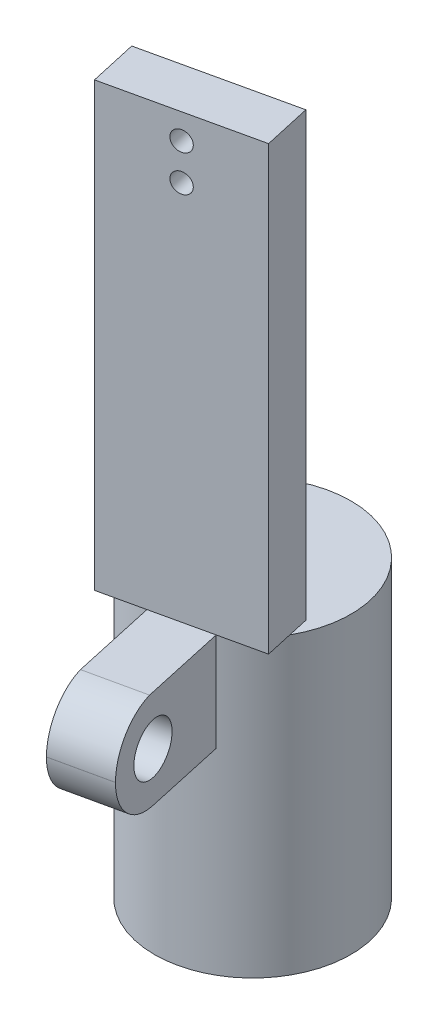
ISO-10303-21;
HEADER;
FILE_DESCRIPTION(('STEP AP214'),'2;1');
FILE_NAME('part.step','',(''),(''),'','','');
FILE_SCHEMA(('AUTOMOTIVE_DESIGN { 1 0 10303 214 1 1 1 1 }'));
ENDSEC;
DATA;
#1=APPLICATION_CONTEXT('core data for automotive mechanical design processes');
#2=APPLICATION_PROTOCOL_DEFINITION('international standard','automotive_design',2000,#1);
#3=PRODUCT_CONTEXT('',#1,'mechanical');
#4=PRODUCT('Part','Part','',(#3));
#5=PRODUCT_RELATED_PRODUCT_CATEGORY('part','',(#4));
#6=PRODUCT_DEFINITION_FORMATION('','',#4);
#7=PRODUCT_DEFINITION_CONTEXT('part definition',#1,'design');
#8=PRODUCT_DEFINITION('design','',#6,#7);
#9=PRODUCT_DEFINITION_SHAPE('','',#8);
#10=(LENGTH_UNIT() NAMED_UNIT(*) SI_UNIT(.MILLI.,.METRE.));
#11=(NAMED_UNIT(*) PLANE_ANGLE_UNIT() SI_UNIT($,.RADIAN.));
#12=(NAMED_UNIT(*) SI_UNIT($,.STERADIAN.) SOLID_ANGLE_UNIT());
#13=UNCERTAINTY_MEASURE_WITH_UNIT(LENGTH_MEASURE(1.E-05),#10,'distance_accuracy_value','');
#14=(GEOMETRIC_REPRESENTATION_CONTEXT(3) GLOBAL_UNCERTAINTY_ASSIGNED_CONTEXT((#13)) GLOBAL_UNIT_ASSIGNED_CONTEXT((#10,
#11,#12)) REPRESENTATION_CONTEXT('',''));
#15=CARTESIAN_POINT('',(0.,0.,0.));
#16=DIRECTION('',(0.,0.,1.));
#17=DIRECTION('',(1.,0.,0.));
#18=AXIS2_PLACEMENT_3D('',#15,#16,#17);
#19=CARTESIAN_POINT('',(0.,30.,0.));
#20=DIRECTION('',(0.,1.,0.));
#21=DIRECTION('',(0.,0.,1.));
#22=AXIS2_PLACEMENT_3D('',#19,#20,#21);
#23=PLANE('',#22);
#24=DIRECTION('',(0.21493462100566,0.,0.976628439424715));
#25=VECTOR('',#24,1.);
#26=CARTESIAN_POINT('',(2.9138020787842,30.,-0.641264292751803));
#27=LINE('',#26,#25);
#28=CARTESIAN_POINT('',(4.96525747374803,30.,8.6802199407267));
#29=VERTEX_POINT('',#28);
#30=CARTESIAN_POINT('',(6.87892830840499,30.,17.3756332346809));
#31=VERTEX_POINT('',#30);
#32=EDGE_CURVE('E320',#29,#31,#27,.T.);
#33=ORIENTED_EDGE('',*,*,#32,.F.);
#34=DIRECTION('',(-0.975868141278159,0.,0.218360643977598));
#35=VECTOR('',#34,1.);
#36=CARTESIAN_POINT('',(2.08642872960106,30.,9.32438780714541));
#37=LINE('',#36,#35);
#38=CARTESIAN_POINT('',(-0.792400014545913,30.,9.96855567356413));
#39=VERTEX_POINT('',#38);
#40=EDGE_CURVE('E11',#29,#39,#37,.T.);
#41=ORIENTED_EDGE('',*,*,#40,.T.);
#42=DIRECTION('',(0.21493462100566,0.,0.976628439424715));
#43=VECTOR('',#42,1.);
#44=CARTESIAN_POINT('',(-2.84830571382161,30.,0.626849971181591));
#45=LINE('',#44,#43);
#46=CARTESIAN_POINT('',(1.11682051579917,30.,18.6437474986143));
#47=VERTEX_POINT('',#46);
#48=EDGE_CURVE('E317',#39,#47,#45,.T.);
#49=ORIENTED_EDGE('',*,*,#48,.T.);
#50=DIRECTION('',(0.976628439424714,0.,-0.21493462100566));
#51=VECTOR('',#50,1.);
#52=CARTESIAN_POINT('',(-10.4195983241497,30.,21.1826616967176));
#53=LINE('',#52,#51);
#54=EDGE_CURVE('E183',#47,#31,#53,.T.);
#55=ORIENTED_EDGE('',*,*,#54,.T.);
#56=EDGE_LOOP('',(#33,#41,#49,#55));
#57=FACE_BOUND('',#56,.T.);
#58=ADVANCED_FACE('F37',(#57),#23,.T.);
#59=CARTESIAN_POINT('',(0.,30.,0.));
#60=DIRECTION('',(0.,1.,0.));
#61=DIRECTION('',(0.,0.,1.));
#62=AXIS2_PLACEMENT_3D('',#59,#60,#61);
#63=CIRCLE('',#62,10.);
#64=CARTESIAN_POINT('',(8.70491565484811,30.,4.92183334154869));
#65=VERTEX_POINT('',#64);
#66=CARTESIAN_POINT('',(-5.77719232770779,30.,8.16235559190325));
#67=VERTEX_POINT('',#66);
#68=EDGE_CURVE('E290',#65,#67,#63,.T.);
#69=ORIENTED_EDGE('',*,*,#68,.T.);
#70=DIRECTION('',(-0.218360643977597,0.,-0.975868141278159));
#71=VECTOR('',#70,1.);
#72=CARTESIAN_POINT('',(-7.24105399127795,30.,1.62026112517727));
#73=LINE('',#72,#71);
#74=CARTESIAN_POINT('',(-6.24642848156488,30.,6.0653082259319));
#75=VERTEX_POINT('',#74);
#76=EDGE_CURVE('E46',#67,#75,#73,.T.);
#77=ORIENTED_EDGE('',*,*,#76,.T.);
#78=DIRECTION('',(0.975868141278159,0.,-0.218360643977598));
#79=VECTOR('',#78,1.);
#80=CARTESIAN_POINT('',(0.994625509713067,30.,4.44504710075462));
#81=LINE('',#80,#79);
#82=CARTESIAN_POINT('',(8.23567950099102,30.,2.82478597557734));
#83=VERTEX_POINT('',#82);
#84=EDGE_CURVE('E155',#75,#83,#81,.T.);
#85=ORIENTED_EDGE('',*,*,#84,.T.);
#86=DIRECTION('',(-0.218360643977598,0.,-0.975868141278159));
#87=VECTOR('',#86,1.);
#88=CARTESIAN_POINT('',(7.24105399127795,30.,-1.62026112517728));
#89=LINE('',#88,#87);
#90=EDGE_CURVE('E166',#65,#83,#89,.T.);
#91=ORIENTED_EDGE('',*,*,#90,.F.);
#92=EDGE_LOOP('',(#69,#77,#85,#91));
#93=FACE_BOUND('',#92,.T.);
#94=ADVANCED_FACE('F221',(#93),#23,.T.);
#95=CARTESIAN_POINT('',(2.9138020787842,20.,-0.641264292751803));
#96=DIRECTION('',(-0.976628439424715,0.,0.21493462100566));
#97=DIRECTION('',(0.21493462100566,0.,0.976628439424715));
#98=AXIS2_PLACEMENT_3D('',#95,#96,#97);
#99=PLANE('',#98);
#100=CARTESIAN_POINT('',(6.77993867446128,25.0087601473406,16.925840217319));
#101=DIRECTION('',(0.976628439424715,0.,-0.21493462100566));
#102=DIRECTION('',(-0.21493462100566,0.,-0.976628439424715));
#103=AXIS2_PLACEMENT_3D('',#100,#101,#102);
#104=CIRCLE('',#103,5.01244331368161);
#105=CARTESIAN_POINT('',(7.85728598844492,25.0139609072337,21.8211335909563));
#106=VERTEX_POINT('',#105);
#107=EDGE_CURVE('E180',#31,#106,#104,.T.);
#108=ORIENTED_EDGE('',*,*,#107,.T.);
#109=DIRECTION('',(0.,1.,0.));
#110=VECTOR('',#109,1.);
#111=CARTESIAN_POINT('',(7.85728627839978,20.,21.8211349084647));
#112=LINE('',#111,#110);
#113=CARTESIAN_POINT('',(7.85728627839979,25.0087601473406,21.8211349084647));
#114=VERTEX_POINT('',#113);
#115=EDGE_CURVE('E293',#114,#106,#112,.T.);
#116=ORIENTED_EDGE('',*,*,#115,.F.);
#117=CARTESIAN_POINT('',(6.77993867446128,25.0087601473406,16.925840217319));
#118=DIRECTION('',(0.976628439424715,0.,-0.21493462100566));
#119=DIRECTION('',(-0.21493462100566,0.,-0.976628439424715));
#120=AXIS2_PLACEMENT_3D('',#117,#118,#119);
#121=CIRCLE('',#120,5.01244331368161);
#122=CARTESIAN_POINT('',(6.82123172639271,20.,17.1134692213304));
#123=VERTEX_POINT('',#122);
#124=EDGE_CURVE('E331',#114,#123,#121,.T.);
#125=ORIENTED_EDGE('',*,*,#124,.T.);
#126=DIRECTION('',(0.21493462100566,0.,0.976628439424715));
#127=VECTOR('',#126,1.);
#128=CARTESIAN_POINT('',(2.9138020787842,20.,-0.641264292751803));
#129=LINE('',#128,#127);
#130=CARTESIAN_POINT('',(4.96525747374803,20.,8.68021994072669));
#131=VERTEX_POINT('',#130);
#132=EDGE_CURVE('E305',#131,#123,#129,.T.);
#133=ORIENTED_EDGE('',*,*,#132,.F.);
#134=DIRECTION('',(0.,1.,0.));
#135=VECTOR('',#134,1.);
#136=CARTESIAN_POINT('',(4.96525747374803,20.,8.68021994072669));
#137=LINE('',#136,#135);
#138=EDGE_CURVE('E288',#131,#29,#137,.T.);
#139=ORIENTED_EDGE('',*,*,#138,.T.);
#140=ORIENTED_EDGE('',*,*,#32,.T.);
#141=EDGE_LOOP('',(#108,#116,#125,#133,#139,#140));
#142=FACE_BOUND('',#141,.T.);
#143=CARTESIAN_POINT('',(6.77993867446128,25.0087601473406,16.925840217319));
#144=DIRECTION('',(0.976628439424715,0.,-0.21493462100566));
#145=DIRECTION('',(-0.21493462100566,0.,-0.976628439424715));
#146=AXIS2_PLACEMENT_3D('',#143,#144,#145);
#147=CIRCLE('',#146,2.55);
#148=CARTESIAN_POINT('',(6.23185539089685,25.0087601473406,14.4354376967859));
#149=VERTEX_POINT('',#148);
#150=EDGE_CURVE('E175',#149,#149,#147,.T.);
#151=ORIENTED_EDGE('',*,*,#150,.F.);
#152=EDGE_LOOP('',(#151));
#153=FACE_BOUND('',#152,.T.);
#154=ADVANCED_FACE('F217',(#142,#153),#99,.F.);
#155=CARTESIAN_POINT('',(-2.84830571382161,20.,0.626849971181591));
#156=DIRECTION('',(-0.976628439424715,0.,0.21493462100566));
#157=DIRECTION('',(0.21493462100566,0.,0.976628439424715));
#158=AXIS2_PLACEMENT_3D('',#155,#156,#157);
#159=PLANE('',#158);
#160=CARTESIAN_POINT('',(1.01783088185546,25.0087601473406,18.1939544812524));
#161=DIRECTION('',(-0.976628439424715,0.,0.21493462100566));
#162=DIRECTION('',(0.21493462100566,0.,0.976628439424715));
#163=AXIS2_PLACEMENT_3D('',#160,#161,#162);
#164=CIRCLE('',#163,2.55);
#165=CARTESIAN_POINT('',(1.5659141654199,25.0087601473406,20.6843570017854));
#166=VERTEX_POINT('',#165);
#167=EDGE_CURVE('E235',#166,#166,#164,.T.);
#168=ORIENTED_EDGE('',*,*,#167,.F.);
#169=EDGE_LOOP('',(#168));
#170=FACE_BOUND('',#169,.T.);
#171=DIRECTION('',(0.,1.,0.));
#172=VECTOR('',#171,1.);
#173=CARTESIAN_POINT('',(2.09517848579397,20.,23.0892491723981));
#174=LINE('',#173,#172);
#175=CARTESIAN_POINT('',(2.09517848579397,25.0087601473406,23.0892491723981));
#176=VERTEX_POINT('',#175);
#177=CARTESIAN_POINT('',(2.09517819583911,25.0139609065339,23.0892478548897));
#178=VERTEX_POINT('',#177);
#179=EDGE_CURVE('E298',#176,#178,#174,.T.);
#180=ORIENTED_EDGE('',*,*,#179,.T.);
#181=CARTESIAN_POINT('',(1.01783088185546,25.0087601473406,18.1939544812524));
#182=DIRECTION('',(-0.976628439424715,0.,0.21493462100566));
#183=DIRECTION('',(0.21493462100566,0.,0.976628439424715));
#184=AXIS2_PLACEMENT_3D('',#181,#182,#183);
#185=CIRCLE('',#184,5.01244331368161);
#186=EDGE_CURVE('E334',#178,#47,#185,.T.);
#187=ORIENTED_EDGE('',*,*,#186,.T.);
#188=ORIENTED_EDGE('',*,*,#48,.F.);
#189=DIRECTION('',(0.,1.,0.));
#190=VECTOR('',#189,1.);
#191=CARTESIAN_POINT('',(-0.792400014545913,20.,9.96855567356413));
#192=LINE('',#191,#190);
#193=CARTESIAN_POINT('',(-0.792400014545913,20.,9.96855567356413));
#194=VERTEX_POINT('',#193);
#195=EDGE_CURVE('E301',#194,#39,#192,.T.);
#196=ORIENTED_EDGE('',*,*,#195,.F.);
#197=DIRECTION('',(0.21493462100566,0.,0.976628439424715));
#198=VECTOR('',#197,1.);
#199=CARTESIAN_POINT('',(-2.84830571382161,20.,0.626849971181591));
#200=LINE('',#199,#198);
#201=CARTESIAN_POINT('',(1.0591239337869,20.,18.3815834852639));
#202=VERTEX_POINT('',#201);
#203=EDGE_CURVE('E308',#194,#202,#200,.T.);
#204=ORIENTED_EDGE('',*,*,#203,.T.);
#205=CARTESIAN_POINT('',(1.01783088185546,25.0087601473406,18.1939544812524));
#206=DIRECTION('',(-0.976628439424715,0.,0.21493462100566));
#207=DIRECTION('',(0.21493462100566,0.,0.976628439424715));
#208=AXIS2_PLACEMENT_3D('',#205,#206,#207);
#209=CIRCLE('',#208,5.01244331368161);
#210=EDGE_CURVE('E321',#202,#176,#209,.T.);
#211=ORIENTED_EDGE('',*,*,#210,.T.);
#212=EDGE_LOOP('',(#180,#187,#188,#196,#204,#211));
#213=FACE_BOUND('',#212,.T.);
#214=ADVANCED_FACE('F220',(#170,#213),#159,.T.);
#215=CARTESIAN_POINT('',(4.9434841996156,20.,22.4623992012165));
#216=DIRECTION('',(-0.214934621005661,0.,-0.976628439424714));
#217=DIRECTION('',(-0.976628439424714,0.,0.214934621005661));
#218=AXIS2_PLACEMENT_3D('',#215,#216,#217);
#219=PLANE('',#218);
#220=CARTESIAN_POINT('',(2.09517790588424,25.013960905834,23.0892465373813));
#221=DIRECTION('',(0.976628439424715,0.,-0.21493462100566));
#222=VECTOR('',#221,1.);
#223=LINE('',#220,#222);
#224=EDGE_CURVE('E188',#178,#106,#223,.T.);
#225=ORIENTED_EDGE('',*,*,#224,.F.);
#226=ORIENTED_EDGE('',*,*,#179,.F.);
#227=DIRECTION('',(0.976628439424715,0.,-0.21493462100566));
#228=VECTOR('',#227,1.);
#229=CARTESIAN_POINT('',(-9.44124035415487,25.0087601473406,25.6281633705014));
#230=LINE('',#229,#228);
#231=EDGE_CURVE('E328',#176,#114,#230,.T.);
#232=ORIENTED_EDGE('',*,*,#231,.T.);
#233=ORIENTED_EDGE('',*,*,#115,.T.);
#234=EDGE_LOOP('',(#225,#226,#232,#233));
#235=FACE_BOUND('',#234,.T.);
#236=ADVANCED_FACE('F215',(#235),#219,.F.);
#237=CARTESIAN_POINT('',(0.,20.,0.));
#238=DIRECTION('',(0.,1.,0.));
#239=DIRECTION('',(0.,0.,1.));
#240=AXIS2_PLACEMENT_3D('',#237,#238,#239);
#241=PLANE('',#240);
#242=DIRECTION('',(0.976628439424715,0.,-0.21493462100566));
#243=VECTOR('',#242,1.);
#244=CARTESIAN_POINT('',(-10.4772949061619,20.,20.9204976833672));
#245=LINE('',#244,#243);
#246=EDGE_CURVE('E242',#202,#123,#245,.T.);
#247=ORIENTED_EDGE('',*,*,#246,.F.);
#248=ORIENTED_EDGE('',*,*,#203,.F.);
#249=CARTESIAN_POINT('',(0.,20.,0.));
#250=DIRECTION('',(0.,1.,0.));
#251=DIRECTION('',(0.,0.,1.));
#252=AXIS2_PLACEMENT_3D('',#249,#250,#251);
#253=CIRCLE('',#252,10.);
#254=EDGE_CURVE('E313',#194,#131,#253,.T.);
#255=ORIENTED_EDGE('',*,*,#254,.T.);
#256=ORIENTED_EDGE('',*,*,#132,.T.);
#257=EDGE_LOOP('',(#247,#248,#255,#256));
#258=FACE_BOUND('',#257,.T.);
#259=ADVANCED_FACE('F212',(#258),#241,.F.);
#260=CARTESIAN_POINT('',(0.,30.,0.));
#261=DIRECTION('',(0.,-1.,0.));
#262=DIRECTION('',(0.,0.,-1.));
#263=AXIS2_PLACEMENT_3D('',#260,#261,#262);
#264=CYLINDRICAL_SURFACE('',#263,10.);
#265=CARTESIAN_POINT('',(0.,0.,0.));
#266=DIRECTION('',(0.,1.,0.));
#267=DIRECTION('',(0.,0.,1.));
#268=AXIS2_PLACEMENT_3D('',#265,#266,#267);
#269=CIRCLE('',#268,10.);
#270=CARTESIAN_POINT('',(0.,0.,10.));
#271=VERTEX_POINT('',#270);
#272=EDGE_CURVE('E287',#271,#271,#269,.T.);
#273=ORIENTED_EDGE('',*,*,#272,.T.);
#274=EDGE_LOOP('',(#273));
#275=FACE_BOUND('',#274,.T.);
#276=ORIENTED_EDGE('',*,*,#138,.F.);
#277=ORIENTED_EDGE('',*,*,#254,.F.);
#278=ORIENTED_EDGE('',*,*,#195,.T.);
#279=EDGE_CURVE('E63',#67,#39,#63,.T.);
#280=ORIENTED_EDGE('',*,*,#279,.F.);
#281=ORIENTED_EDGE('',*,*,#68,.F.);
#282=EDGE_CURVE('E292',#29,#65,#63,.T.);
#283=ORIENTED_EDGE('',*,*,#282,.F.);
#284=EDGE_LOOP('',(#276,#277,#278,#280,#281,#283));
#285=FACE_BOUND('',#284,.T.);
#286=ADVANCED_FACE('F39',(#275,#285),#264,.T.);
#287=CARTESIAN_POINT('',(0.,0.,0.));
#288=DIRECTION('',(0.,1.,0.));
#289=DIRECTION('',(0.,0.,1.));
#290=AXIS2_PLACEMENT_3D('',#287,#288,#289);
#291=PLANE('',#290);
#292=CARTESIAN_POINT('',(0.,0.,0.));
#293=DIRECTION('',(0.,-1.,0.));
#294=DIRECTION('',(0.,0.,-1.));
#295=AXIS2_PLACEMENT_3D('',#292,#293,#294);
#296=CIRCLE('',#295,5.05);
#297=CARTESIAN_POINT('',(0.,0.,-5.05));
#298=VERTEX_POINT('',#297);
#299=EDGE_CURVE('E136',#298,#298,#296,.T.);
#300=ORIENTED_EDGE('',*,*,#299,.F.);
#301=EDGE_LOOP('',(#300));
#302=FACE_BOUND('',#301,.T.);
#303=ORIENTED_EDGE('',*,*,#272,.F.);
#304=EDGE_LOOP('',(#303));
#305=FACE_BOUND('',#304,.T.);
#306=ADVANCED_FACE('F210',(#302,#305),#291,.F.);
#307=CARTESIAN_POINT('',(-10.5185879580934,25.0087601473406,20.7328686793557));
#308=DIRECTION('',(0.976628439424715,0.,-0.21493462100566));
#309=DIRECTION('',(-0.21493462100566,0.,-0.976628439424715));
#310=AXIS2_PLACEMENT_3D('',#307,#308,#309);
#311=CYLINDRICAL_SURFACE('',#310,5.01244331368161);
#312=ORIENTED_EDGE('',*,*,#246,.T.);
#313=ORIENTED_EDGE('',*,*,#124,.F.);
#314=ORIENTED_EDGE('',*,*,#231,.F.);
#315=ORIENTED_EDGE('',*,*,#210,.F.);
#316=EDGE_LOOP('',(#312,#313,#314,#315));
#317=FACE_BOUND('',#316,.T.);
#318=ADVANCED_FACE('F205',(#317),#311,.T.);
#319=CARTESIAN_POINT('',(-10.5185879580934,25.0087601473406,20.7328686793557));
#320=DIRECTION('',(0.976628439424714,0.,-0.21493462100566));
#321=DIRECTION('',(-0.21493462100566,0.,-0.976628439424715));
#322=AXIS2_PLACEMENT_3D('',#319,#320,#321);
#323=CYLINDRICAL_SURFACE('',#322,5.01244331368161);
#324=ORIENTED_EDGE('',*,*,#224,.T.);
#325=ORIENTED_EDGE('',*,*,#107,.F.);
#326=ORIENTED_EDGE('',*,*,#54,.F.);
#327=ORIENTED_EDGE('',*,*,#186,.F.);
#328=EDGE_LOOP('',(#324,#325,#326,#327));
#329=FACE_BOUND('',#328,.T.);
#330=ADVANCED_FACE('F194',(#329),#323,.T.);
#331=CARTESIAN_POINT('',(-10.5185995929877,25.0087601473406,20.7328712399422));
#332=DIRECTION('',(0.976628439424715,0.,-0.21493462100566));
#333=DIRECTION('',(-0.21493462100566,0.,-0.976628439424715));
#334=AXIS2_PLACEMENT_3D('',#331,#332,#333);
#335=CYLINDRICAL_SURFACE('',#334,2.55);
#336=ORIENTED_EDGE('',*,*,#150,.T.);
#337=EDGE_LOOP('',(#336));
#338=FACE_BOUND('',#337,.T.);
#339=ORIENTED_EDGE('',*,*,#167,.T.);
#340=EDGE_LOOP('',(#339));
#341=FACE_BOUND('',#340,.T.);
#342=ADVANCED_FACE('F204',(#338,#341),#335,.F.);
#343=CARTESIAN_POINT('',(0.,25.,0.));
#344=DIRECTION('',(0.,-1.,0.));
#345=DIRECTION('',(0.,0.,-1.));
#346=AXIS2_PLACEMENT_3D('',#343,#344,#345);
#347=CYLINDRICAL_SURFACE('',#346,5.05);
#348=CARTESIAN_POINT('',(0.,25.,0.));
#349=DIRECTION('',(0.,-1.,0.));
#350=DIRECTION('',(0.,0.,-1.));
#351=AXIS2_PLACEMENT_3D('',#348,#349,#350);
#352=CIRCLE('',#351,5.05);
#353=CARTESIAN_POINT('',(0.,25.,-5.05));
#354=VERTEX_POINT('',#353);
#355=EDGE_CURVE('E172',#354,#354,#352,.T.);
#356=ORIENTED_EDGE('',*,*,#355,.F.);
#357=EDGE_LOOP('',(#356));
#358=FACE_BOUND('',#357,.T.);
#359=ORIENTED_EDGE('',*,*,#299,.T.);
#360=EDGE_LOOP('',(#359));
#361=FACE_BOUND('',#360,.T.);
#362=ADVANCED_FACE('F463',(#358,#361),#347,.F.);
#363=CARTESIAN_POINT('',(0.,25.,0.));
#364=DIRECTION('',(0.,-1.,0.));
#365=DIRECTION('',(0.,0.,-1.));
#366=AXIS2_PLACEMENT_3D('',#363,#364,#365);
#367=PLANE('',#366);
#368=ORIENTED_EDGE('',*,*,#355,.T.);
#369=EDGE_LOOP('',(#368));
#370=FACE_BOUND('',#369,.T.);
#371=ADVANCED_FACE('F362',(#370),#367,.T.);
#372=CARTESIAN_POINT('',(0.,30.,0.));
#373=DIRECTION('',(0.,1.,0.));
#374=DIRECTION('',(0.,0.,1.));
#375=AXIS2_PLACEMENT_3D('',#372,#373,#374);
#376=PLANE('',#375);
#377=CARTESIAN_POINT('',(9.32748272087901,30.,7.70412668196814));
#378=VERTEX_POINT('',#377);
#379=EDGE_CURVE('E48',#378,#29,#37,.T.);
#380=ORIENTED_EDGE('',*,*,#379,.T.);
#381=ORIENTED_EDGE('',*,*,#282,.T.);
#382=EDGE_CURVE('E164',#378,#65,#89,.T.);
#383=ORIENTED_EDGE('',*,*,#382,.F.);
#384=EDGE_LOOP('',(#380,#381,#383));
#385=FACE_BOUND('',#384,.T.);
#386=ADVANCED_FACE('F267',(#385),#376,.F.);
#387=CARTESIAN_POINT('',(-5.15462526167689,30.,10.9446489323227));
#388=VERTEX_POINT('',#387);
#389=EDGE_CURVE('E152',#388,#67,#73,.T.);
#390=ORIENTED_EDGE('',*,*,#389,.T.);
#391=ORIENTED_EDGE('',*,*,#279,.T.);
#392=EDGE_CURVE('E49',#39,#388,#37,.T.);
#393=ORIENTED_EDGE('',*,*,#392,.T.);
#394=EDGE_LOOP('',(#390,#391,#393));
#395=FACE_BOUND('',#394,.T.);
#396=ADVANCED_FACE('F258',(#395),#376,.F.);
#397=CARTESIAN_POINT('',(2.08642872960106,75.,9.32438780714541));
#398=DIRECTION('',(0.218360643977598,0.,0.975868141278159));
#399=DIRECTION('',(0.975868141278159,0.,-0.218360643977598));
#400=AXIS2_PLACEMENT_3D('',#397,#398,#399);
#401=PLANE('',#400);
#402=CARTESIAN_POINT('',(2.08642872960106,72.4260815625613,9.32438780714542));
#403=DIRECTION('',(0.218360643977598,0.,0.975868141278159));
#404=DIRECTION('',(0.975868141278159,0.,-0.218360643977598));
#405=AXIS2_PLACEMENT_3D('',#402,#403,#404);
#406=CIRCLE('',#405,1.);
#407=CARTESIAN_POINT('',(3.06229687087922,72.4260815625613,9.10602716316782));
#408=VERTEX_POINT('',#407);
#409=EDGE_CURVE('E245',#408,#408,#406,.T.);
#410=ORIENTED_EDGE('',*,*,#409,.F.);
#411=EDGE_LOOP('',(#410));
#412=FACE_BOUND('',#411,.T.);
#413=CARTESIAN_POINT('',(2.08642872960106,68.7354547770909,9.32438780714542));
#414=DIRECTION('',(0.218360643977598,0.,0.975868141278159));
#415=DIRECTION('',(0.975868141278159,0.,-0.218360643977598));
#416=AXIS2_PLACEMENT_3D('',#413,#414,#415);
#417=CIRCLE('',#416,1.);
#418=CARTESIAN_POINT('',(3.06229687087922,68.7354547770909,9.10602716316782));
#419=VERTEX_POINT('',#418);
#420=EDGE_CURVE('E158',#419,#419,#417,.T.);
#421=ORIENTED_EDGE('',*,*,#420,.F.);
#422=EDGE_LOOP('',(#421));
#423=FACE_BOUND('',#422,.T.);
#424=ORIENTED_EDGE('',*,*,#379,.F.);
#425=DIRECTION('',(0.,-1.,0.));
#426=VECTOR('',#425,1.);
#427=CARTESIAN_POINT('',(9.32748272087901,75.,7.70412668196814));
#428=LINE('',#427,#426);
#429=CARTESIAN_POINT('',(9.32748272087901,75.,7.70412668196814));
#430=VERTEX_POINT('',#429);
#431=EDGE_CURVE('E124',#430,#378,#428,.T.);
#432=ORIENTED_EDGE('',*,*,#431,.F.);
#433=DIRECTION('',(-0.975868141278159,0.,0.218360643977598));
#434=VECTOR('',#433,1.);
#435=CARTESIAN_POINT('',(2.08642872960106,75.,9.32438780714541));
#436=LINE('',#435,#434);
#437=CARTESIAN_POINT('',(-5.15462526167689,75.,10.9446489323227));
#438=VERTEX_POINT('',#437);
#439=EDGE_CURVE('E129',#430,#438,#436,.T.);
#440=ORIENTED_EDGE('',*,*,#439,.T.);
#441=DIRECTION('',(0.,-1.,0.));
#442=VECTOR('',#441,1.);
#443=CARTESIAN_POINT('',(-5.15462526167689,75.,10.9446489323227));
#444=LINE('',#443,#442);
#445=EDGE_CURVE('E162',#438,#388,#444,.T.);
#446=ORIENTED_EDGE('',*,*,#445,.T.);
#447=ORIENTED_EDGE('',*,*,#392,.F.);
#448=ORIENTED_EDGE('',*,*,#40,.F.);
#449=EDGE_LOOP('',(#424,#432,#440,#446,#447,#448));
#450=FACE_BOUND('',#449,.T.);
#451=ADVANCED_FACE('F126',(#412,#423,#450),#401,.T.);
#452=CARTESIAN_POINT('',(7.24105399127795,75.,-1.62026112517728));
#453=DIRECTION('',(-0.975868141278159,0.,0.218360643977598));
#454=DIRECTION('',(0.218360643977598,0.,0.975868141278159));
#455=AXIS2_PLACEMENT_3D('',#452,#453,#454);
#456=PLANE('',#455);
#457=ORIENTED_EDGE('',*,*,#382,.T.);
#458=ORIENTED_EDGE('',*,*,#90,.T.);
#459=DIRECTION('',(0.,-1.,0.));
#460=VECTOR('',#459,1.);
#461=CARTESIAN_POINT('',(8.23567950099102,75.,2.82478597557734));
#462=LINE('',#461,#460);
#463=CARTESIAN_POINT('',(8.23567950099102,75.,2.82478597557734));
#464=VERTEX_POINT('',#463);
#465=EDGE_CURVE('E137',#464,#83,#462,.T.);
#466=ORIENTED_EDGE('',*,*,#465,.F.);
#467=DIRECTION('',(-0.218360643977598,0.,-0.975868141278159));
#468=VECTOR('',#467,1.);
#469=CARTESIAN_POINT('',(7.24105399127795,75.,-1.62026112517728));
#470=LINE('',#469,#468);
#471=EDGE_CURVE('E140',#430,#464,#470,.T.);
#472=ORIENTED_EDGE('',*,*,#471,.F.);
#473=ORIENTED_EDGE('',*,*,#431,.T.);
#474=EDGE_LOOP('',(#457,#458,#466,#472,#473));
#475=FACE_BOUND('',#474,.T.);
#476=ADVANCED_FACE('F141',(#475),#456,.F.);
#477=CARTESIAN_POINT('',(0.994625509713067,75.,4.44504710075462));
#478=DIRECTION('',(-0.218360643977598,0.,-0.975868141278159));
#479=DIRECTION('',(-0.975868141278159,0.,0.218360643977598));
#480=AXIS2_PLACEMENT_3D('',#477,#478,#479);
#481=PLANE('',#480);
#482=CARTESIAN_POINT('',(0.994625509713068,72.4260815625613,4.44504710075462));
#483=DIRECTION('',(-0.218360643977598,0.,-0.975868141278159));
#484=DIRECTION('',(-0.975868141278159,0.,0.218360643977598));
#485=AXIS2_PLACEMENT_3D('',#482,#483,#484);
#486=CIRCLE('',#485,1.);
#487=CARTESIAN_POINT('',(0.0187573684349065,72.4260815625613,4.66340774473222));
#488=VERTEX_POINT('',#487);
#489=EDGE_CURVE('E41',#488,#488,#486,.T.);
#490=ORIENTED_EDGE('',*,*,#489,.F.);
#491=EDGE_LOOP('',(#490));
#492=FACE_BOUND('',#491,.T.);
#493=CARTESIAN_POINT('',(0.994625509713068,68.7354547770909,4.44504710075462));
#494=DIRECTION('',(-0.218360643977598,0.,-0.975868141278159));
#495=DIRECTION('',(-0.975868141278159,0.,0.218360643977598));
#496=AXIS2_PLACEMENT_3D('',#493,#494,#495);
#497=CIRCLE('',#496,1.);
#498=CARTESIAN_POINT('',(0.0187573684349065,68.7354547770909,4.66340774473222));
#499=VERTEX_POINT('',#498);
#500=EDGE_CURVE('E243',#499,#499,#497,.T.);
#501=ORIENTED_EDGE('',*,*,#500,.F.);
#502=EDGE_LOOP('',(#501));
#503=FACE_BOUND('',#502,.T.);
#504=ORIENTED_EDGE('',*,*,#84,.F.);
#505=DIRECTION('',(0.,-1.,0.));
#506=VECTOR('',#505,1.);
#507=CARTESIAN_POINT('',(-6.24642848156488,75.,6.0653082259319));
#508=LINE('',#507,#506);
#509=CARTESIAN_POINT('',(-6.24642848156488,75.,6.0653082259319));
#510=VERTEX_POINT('',#509);
#511=EDGE_CURVE('E169',#510,#75,#508,.T.);
#512=ORIENTED_EDGE('',*,*,#511,.F.);
#513=DIRECTION('',(0.975868141278159,0.,-0.218360643977598));
#514=VECTOR('',#513,1.);
#515=CARTESIAN_POINT('',(0.994625509713067,75.,4.44504710075462));
#516=LINE('',#515,#514);
#517=EDGE_CURVE('E147',#510,#464,#516,.T.);
#518=ORIENTED_EDGE('',*,*,#517,.T.);
#519=ORIENTED_EDGE('',*,*,#465,.T.);
#520=EDGE_LOOP('',(#504,#512,#518,#519));
#521=FACE_BOUND('',#520,.T.);
#522=ADVANCED_FACE('F265',(#492,#503,#521),#481,.T.);
#523=CARTESIAN_POINT('',(-7.24105399127795,75.,1.62026112517727));
#524=DIRECTION('',(-0.975868141278159,0.,0.218360643977597));
#525=DIRECTION('',(0.218360643977597,0.,0.975868141278159));
#526=AXIS2_PLACEMENT_3D('',#523,#524,#525);
#527=PLANE('',#526);
#528=ORIENTED_EDGE('',*,*,#389,.F.);
#529=ORIENTED_EDGE('',*,*,#445,.F.);
#530=DIRECTION('',(-0.218360643977597,0.,-0.975868141278159));
#531=VECTOR('',#530,1.);
#532=CARTESIAN_POINT('',(-7.24105399127795,75.,1.62026112517727));
#533=LINE('',#532,#531);
#534=EDGE_CURVE('E151',#438,#510,#533,.T.);
#535=ORIENTED_EDGE('',*,*,#534,.T.);
#536=ORIENTED_EDGE('',*,*,#511,.T.);
#537=ORIENTED_EDGE('',*,*,#76,.F.);
#538=EDGE_LOOP('',(#528,#529,#535,#536,#537));
#539=FACE_BOUND('',#538,.T.);
#540=ADVANCED_FACE('F351',(#539),#527,.T.);
#541=CARTESIAN_POINT('',(0.,75.,0.));
#542=DIRECTION('',(0.,1.,0.));
#543=DIRECTION('',(0.,0.,1.));
#544=AXIS2_PLACEMENT_3D('',#541,#542,#543);
#545=PLANE('',#544);
#546=ORIENTED_EDGE('',*,*,#439,.F.);
#547=ORIENTED_EDGE('',*,*,#471,.T.);
#548=ORIENTED_EDGE('',*,*,#517,.F.);
#549=ORIENTED_EDGE('',*,*,#534,.F.);
#550=EDGE_LOOP('',(#546,#547,#548,#549));
#551=FACE_BOUND('',#550,.T.);
#552=ADVANCED_FACE('F149',(#551),#545,.T.);
#553=CARTESIAN_POINT('',(-2.60772566605031,68.7354547770909,-11.6540982492841));
#554=DIRECTION('',(0.218360643977598,0.,0.975868141278159));
#555=DIRECTION('',(0.975868141278159,0.,-0.218360643977598));
#556=AXIS2_PLACEMENT_3D('',#553,#554,#555);
#557=CYLINDRICAL_SURFACE('',#556,1.);
#558=ORIENTED_EDGE('',*,*,#500,.T.);
#559=EDGE_LOOP('',(#558));
#560=FACE_BOUND('',#559,.T.);
#561=ORIENTED_EDGE('',*,*,#420,.T.);
#562=EDGE_LOOP('',(#561));
#563=FACE_BOUND('',#562,.T.);
#564=ADVANCED_FACE('F255',(#560,#563),#557,.F.);
#565=CARTESIAN_POINT('',(-2.60772566605031,72.4260815625613,-11.6540982492841));
#566=DIRECTION('',(0.218360643977598,0.,0.975868141278159));
#567=DIRECTION('',(0.975868141278159,0.,-0.218360643977598));
#568=AXIS2_PLACEMENT_3D('',#565,#566,#567);
#569=CYLINDRICAL_SURFACE('',#568,1.);
#570=ORIENTED_EDGE('',*,*,#489,.T.);
#571=EDGE_LOOP('',(#570));
#572=FACE_BOUND('',#571,.T.);
#573=ORIENTED_EDGE('',*,*,#409,.T.);
#574=EDGE_LOOP('',(#573));
#575=FACE_BOUND('',#574,.T.);
#576=ADVANCED_FACE('F366',(#572,#575),#569,.F.);
#577=CLOSED_SHELL('',(#58,#94,#154,#214,#236,#259,#286,#306,#318,#330,#342,#362,#371,#386,#396,
#451,#476,#522,#540,#552,#564,#576));
#578=MANIFOLD_SOLID_BREP('B2',#577);
#579=ADVANCED_BREP_SHAPE_REPRESENTATION('',(#18,#578),#14);
#580=SHAPE_DEFINITION_REPRESENTATION(#9,#579);
ENDSEC;
END-ISO-10303-21;
